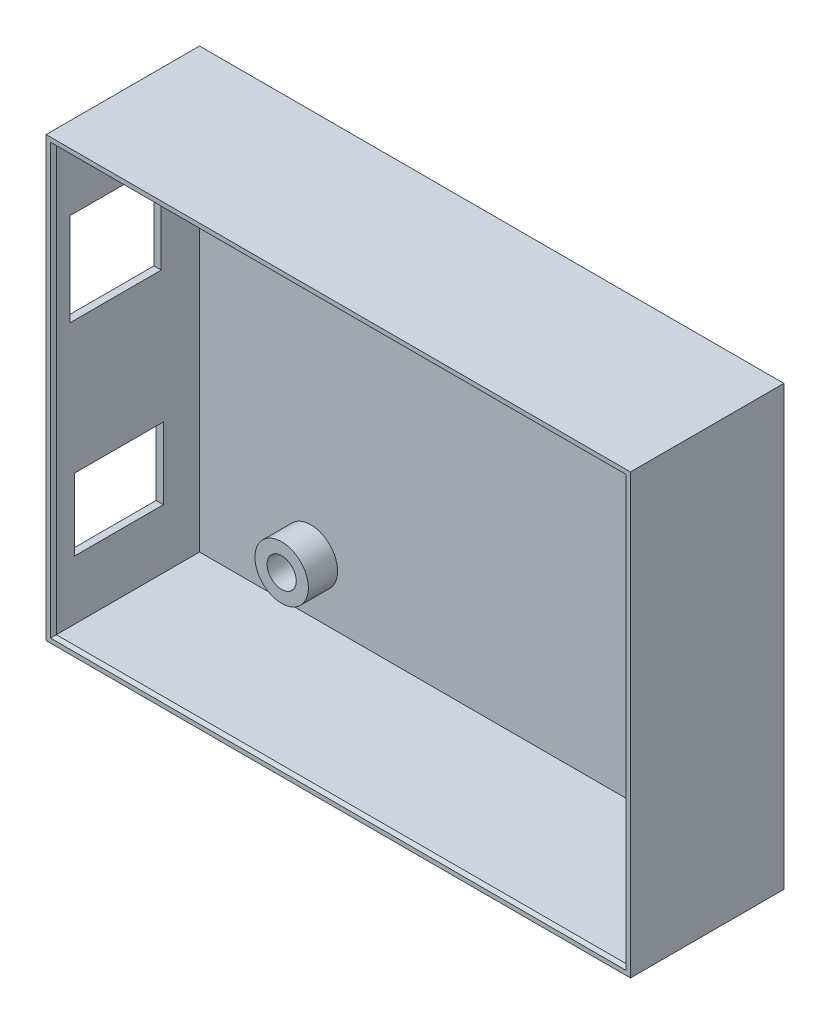
ISO-10303-21;
HEADER;
FILE_DESCRIPTION(('STEP AP214'),'2;1');
FILE_NAME('part.step','',(''),(''),'','','');
FILE_SCHEMA(('AUTOMOTIVE_DESIGN { 1 0 10303 214 1 1 1 1 }'));
ENDSEC;
DATA;
#1=APPLICATION_CONTEXT('core data for automotive mechanical design processes');
#2=APPLICATION_PROTOCOL_DEFINITION('international standard','automotive_design',2000,#1);
#3=PRODUCT_CONTEXT('',#1,'mechanical');
#4=PRODUCT('Part','Part','',(#3));
#5=PRODUCT_RELATED_PRODUCT_CATEGORY('part','',(#4));
#6=PRODUCT_DEFINITION_FORMATION('','',#4);
#7=PRODUCT_DEFINITION_CONTEXT('part definition',#1,'design');
#8=PRODUCT_DEFINITION('design','',#6,#7);
#9=PRODUCT_DEFINITION_SHAPE('','',#8);
#10=(LENGTH_UNIT() NAMED_UNIT(*) SI_UNIT(.MILLI.,.METRE.));
#11=(NAMED_UNIT(*) PLANE_ANGLE_UNIT() SI_UNIT($,.RADIAN.));
#12=(NAMED_UNIT(*) SI_UNIT($,.STERADIAN.) SOLID_ANGLE_UNIT());
#13=UNCERTAINTY_MEASURE_WITH_UNIT(LENGTH_MEASURE(1.E-05),#10,'distance_accuracy_value','');
#14=(GEOMETRIC_REPRESENTATION_CONTEXT(3) GLOBAL_UNCERTAINTY_ASSIGNED_CONTEXT((#13)) GLOBAL_UNIT_ASSIGNED_CONTEXT((#10,
#11,#12)) REPRESENTATION_CONTEXT('',''));
#15=CARTESIAN_POINT('',(0.,0.,0.));
#16=DIRECTION('',(0.,0.,1.));
#17=DIRECTION('',(1.,0.,0.));
#18=AXIS2_PLACEMENT_3D('',#15,#16,#17);
#19=CARTESIAN_POINT('',(57.021978021978,28.6703296703297,22.));
#20=DIRECTION('',(0.,-1.,0.));
#21=DIRECTION('',(0.,0.,-1.));
#22=AXIS2_PLACEMENT_3D('',#19,#20,#21);
#23=PLANE('',#22);
#24=DIRECTION('',(0.,0.,-1.));
#25=VECTOR('',#24,1.);
#26=CARTESIAN_POINT('',(57.021978021978,28.6703296703297,22.));
#27=LINE('',#26,#25);
#28=CARTESIAN_POINT('',(57.021978021978,28.6703296703297,21.6));
#29=VERTEX_POINT('',#28);
#30=CARTESIAN_POINT('',(57.021978021978,28.6703296703297,2.));
#31=VERTEX_POINT('',#30);
#32=EDGE_CURVE('E336',#29,#31,#27,.T.);
#33=ORIENTED_EDGE('',*,*,#32,.F.);
#34=DIRECTION('',(-1.,0.,0.));
#35=VECTOR('',#34,1.);
#36=CARTESIAN_POINT('',(57.021978021978,28.6703296703297,21.6));
#37=LINE('',#36,#35);
#38=CARTESIAN_POINT('',(-20.978021978022,28.6703296703297,21.6));
#39=VERTEX_POINT('',#38);
#40=EDGE_CURVE('E11',#29,#39,#37,.T.);
#41=ORIENTED_EDGE('',*,*,#40,.T.);
#42=DIRECTION('',(0.,0.,-1.));
#43=VECTOR('',#42,1.);
#44=CARTESIAN_POINT('',(-20.978021978022,28.6703296703297,22.));
#45=LINE('',#44,#43);
#46=CARTESIAN_POINT('',(-20.978021978022,28.6703296703297,2.));
#47=VERTEX_POINT('',#46);
#48=EDGE_CURVE('E342',#39,#47,#45,.T.);
#49=ORIENTED_EDGE('',*,*,#48,.T.);
#50=DIRECTION('',(-1.,0.,0.));
#51=VECTOR('',#50,1.);
#52=CARTESIAN_POINT('',(57.021978021978,28.6703296703297,2.));
#53=LINE('',#52,#51);
#54=CARTESIAN_POINT('',(-8.04659818687331,28.6703296703297,2.));
#55=VERTEX_POINT('',#54);
#56=EDGE_CURVE('E327',#55,#47,#53,.T.);
#57=ORIENTED_EDGE('',*,*,#56,.F.);
#58=DIRECTION('',(0.,0.,-1.));
#59=VECTOR('',#58,1.);
#60=CARTESIAN_POINT('',(-8.04659818687331,28.6703296703297,6.));
#61=LINE('',#60,#59);
#62=CARTESIAN_POINT('',(-8.04659818687331,28.6703296703297,6.));
#63=VERTEX_POINT('',#62);
#64=EDGE_CURVE('E200',#55,#63,#61,.F.);
#65=ORIENTED_EDGE('',*,*,#64,.T.);
#66=DIRECTION('',(-1.,0.,0.));
#67=VECTOR('',#66,1.);
#68=CARTESIAN_POINT('',(57.021978021978,28.6703296703297,6.));
#69=LINE('',#68,#67);
#70=CARTESIAN_POINT('',(-3.45151384874039,28.6703296703297,6.));
#71=VERTEX_POINT('',#70);
#72=EDGE_CURVE('E205',#71,#63,#69,.T.);
#73=ORIENTED_EDGE('',*,*,#72,.F.);
#74=DIRECTION('',(0.,0.,-1.));
#75=VECTOR('',#74,1.);
#76=CARTESIAN_POINT('',(-3.45151384874039,28.6703296703297,6.));
#77=LINE('',#76,#75);
#78=CARTESIAN_POINT('',(-3.45151384874039,28.6703296703297,2.));
#79=VERTEX_POINT('',#78);
#80=EDGE_CURVE('E190',#71,#79,#77,.T.);
#81=ORIENTED_EDGE('',*,*,#80,.T.);
#82=EDGE_CURVE('E324',#31,#79,#53,.T.);
#83=ORIENTED_EDGE('',*,*,#82,.F.);
#84=EDGE_LOOP('',(#33,#41,#49,#57,#65,#73,#81,#83));
#85=FACE_BOUND('',#84,.T.);
#86=ADVANCED_FACE('F39',(#85),#23,.T.);
#87=CARTESIAN_POINT('',(-21.978021978022,29.6703296703297,2.));
#88=DIRECTION('',(1.,0.,0.));
#89=DIRECTION('',(0.,0.,-1.));
#90=AXIS2_PLACEMENT_3D('',#87,#88,#89);
#91=PLANE('',#90);
#92=DIRECTION('',(0.,0.,1.));
#93=VECTOR('',#92,1.);
#94=CARTESIAN_POINT('',(-21.978021978022,6.7203296703303,7.24));
#95=LINE('',#94,#93);
#96=CARTESIAN_POINT('',(-21.978021978022,6.7203296703303,7.24));
#97=VERTEX_POINT('',#96);
#98=CARTESIAN_POINT('',(-21.978021978022,6.7203296703303,19.7295944382533));
#99=VERTEX_POINT('',#98);
#100=EDGE_CURVE('E286',#97,#99,#95,.T.);
#101=ORIENTED_EDGE('',*,*,#100,.F.);
#102=DIRECTION('',(0.,-1.,0.));
#103=VECTOR('',#102,1.);
#104=CARTESIAN_POINT('',(-21.978021978022,19.4203296703303,7.24));
#105=LINE('',#104,#103);
#106=CARTESIAN_POINT('',(-21.978021978022,19.4203296703303,7.24));
#107=VERTEX_POINT('',#106);
#108=EDGE_CURVE('E284',#107,#97,#105,.T.);
#109=ORIENTED_EDGE('',*,*,#108,.F.);
#110=DIRECTION('',(0.,0.,-1.));
#111=VECTOR('',#110,1.);
#112=CARTESIAN_POINT('',(-21.978021978022,19.4203296703303,7.24));
#113=LINE('',#112,#111);
#114=CARTESIAN_POINT('',(-21.978021978022,19.4203296703303,19.7295944382533));
#115=VERTEX_POINT('',#114);
#116=EDGE_CURVE('E293',#115,#107,#113,.T.);
#117=ORIENTED_EDGE('',*,*,#116,.F.);
#118=DIRECTION('',(0.,1.,0.));
#119=VECTOR('',#118,1.);
#120=CARTESIAN_POINT('',(-21.978021978022,19.4203296703303,19.7295944382533));
#121=LINE('',#120,#119);
#122=EDGE_CURVE('E290',#99,#115,#121,.T.);
#123=ORIENTED_EDGE('',*,*,#122,.F.);
#124=EDGE_LOOP('',(#101,#109,#117,#123));
#125=FACE_BOUND('',#124,.T.);
#126=DIRECTION('',(0.,0.,1.));
#127=VECTOR('',#126,1.);
#128=CARTESIAN_POINT('',(-21.978021978022,-21.2394045550651,6.94904904372408));
#129=LINE('',#128,#127);
#130=CARTESIAN_POINT('',(-21.978021978022,-21.2394045550651,6.94904904372408));
#131=VERTEX_POINT('',#130);
#132=CARTESIAN_POINT('',(-21.978021978022,-21.2394045550651,19.1175178620637));
#133=VERTEX_POINT('',#132);
#134=EDGE_CURVE('E320',#131,#133,#129,.T.);
#135=ORIENTED_EDGE('',*,*,#134,.F.);
#136=DIRECTION('',(0.,-1.,0.));
#137=VECTOR('',#136,1.);
#138=CARTESIAN_POINT('',(-21.978021978022,-11.4232741193679,6.94904904372408));
#139=LINE('',#138,#137);
#140=CARTESIAN_POINT('',(-21.978021978022,-11.4232741193679,6.94904904372408));
#141=VERTEX_POINT('',#140);
#142=EDGE_CURVE('E287',#141,#131,#139,.T.);
#143=ORIENTED_EDGE('',*,*,#142,.F.);
#144=DIRECTION('',(0.,0.,-1.));
#145=VECTOR('',#144,1.);
#146=CARTESIAN_POINT('',(-21.978021978022,-11.4232741193679,6.94904904372408));
#147=LINE('',#146,#145);
#148=CARTESIAN_POINT('',(-21.978021978022,-11.4232741193679,19.1175178620637));
#149=VERTEX_POINT('',#148);
#150=EDGE_CURVE('E309',#149,#141,#147,.T.);
#151=ORIENTED_EDGE('',*,*,#150,.F.);
#152=DIRECTION('',(0.,1.,0.));
#153=VECTOR('',#152,1.);
#154=CARTESIAN_POINT('',(-21.978021978022,-11.4232741193679,19.1175178620637));
#155=LINE('',#154,#153);
#156=EDGE_CURVE('E317',#133,#149,#155,.T.);
#157=ORIENTED_EDGE('',*,*,#156,.F.);
#158=EDGE_LOOP('',(#135,#143,#151,#157));
#159=FACE_BOUND('',#158,.T.);
#160=DIRECTION('',(0.,0.,-1.));
#161=VECTOR('',#160,1.);
#162=CARTESIAN_POINT('',(-21.978021978022,29.6703296703297,2.));
#163=LINE('',#162,#161);
#164=CARTESIAN_POINT('',(-21.978021978022,29.6703296703297,22.));
#165=VERTEX_POINT('',#164);
#166=CARTESIAN_POINT('',(-21.978021978022,29.6703296703297,1.));
#167=VERTEX_POINT('',#166);
#168=EDGE_CURVE('E356',#165,#167,#163,.T.);
#169=ORIENTED_EDGE('',*,*,#168,.T.);
#170=DIRECTION('',(0.,-1.,0.));
#171=VECTOR('',#170,1.);
#172=CARTESIAN_POINT('',(-21.978021978022,29.6703296703297,1.));
#173=LINE('',#172,#171);
#174=CARTESIAN_POINT('',(-21.978021978022,-30.3296703296703,1.));
#175=VERTEX_POINT('',#174);
#176=EDGE_CURVE('E384',#167,#175,#173,.T.);
#177=ORIENTED_EDGE('',*,*,#176,.T.);
#178=DIRECTION('',(0.,0.,-1.));
#179=VECTOR('',#178,1.);
#180=CARTESIAN_POINT('',(-21.978021978022,-30.3296703296703,2.));
#181=LINE('',#180,#179);
#182=CARTESIAN_POINT('',(-21.978021978022,-30.3296703296703,22.));
#183=VERTEX_POINT('',#182);
#184=EDGE_CURVE('E365',#183,#175,#181,.T.);
#185=ORIENTED_EDGE('',*,*,#184,.F.);
#186=DIRECTION('',(0.,-1.,0.));
#187=VECTOR('',#186,1.);
#188=CARTESIAN_POINT('',(-21.978021978022,29.6703296703297,22.));
#189=LINE('',#188,#187);
#190=EDGE_CURVE('E347',#165,#183,#189,.T.);
#191=ORIENTED_EDGE('',*,*,#190,.F.);
#192=EDGE_LOOP('',(#169,#177,#185,#191));
#193=FACE_BOUND('',#192,.T.);
#194=ADVANCED_FACE('F445',(#125,#159,#193),#91,.F.);
#195=CARTESIAN_POINT('',(-21.978021978022,-30.3296703296703,2.));
#196=DIRECTION('',(0.,1.,0.));
#197=DIRECTION('',(-1.,0.,0.));
#198=AXIS2_PLACEMENT_3D('',#195,#196,#197);
#199=PLANE('',#198);
#200=ORIENTED_EDGE('',*,*,#184,.T.);
#201=DIRECTION('',(1.,0.,0.));
#202=VECTOR('',#201,1.);
#203=CARTESIAN_POINT('',(-21.978021978022,-30.3296703296703,1.));
#204=LINE('',#203,#202);
#205=CARTESIAN_POINT('',(58.021978021978,-30.3296703296703,1.));
#206=VERTEX_POINT('',#205);
#207=EDGE_CURVE('E368',#175,#206,#204,.T.);
#208=ORIENTED_EDGE('',*,*,#207,.T.);
#209=DIRECTION('',(0.,0.,-1.));
#210=VECTOR('',#209,1.);
#211=CARTESIAN_POINT('',(58.021978021978,-30.3296703296703,2.));
#212=LINE('',#211,#210);
#213=CARTESIAN_POINT('',(58.021978021978,-30.3296703296703,22.));
#214=VERTEX_POINT('',#213);
#215=EDGE_CURVE('E362',#214,#206,#212,.T.);
#216=ORIENTED_EDGE('',*,*,#215,.F.);
#217=DIRECTION('',(1.,0.,0.));
#218=VECTOR('',#217,1.);
#219=CARTESIAN_POINT('',(-21.978021978022,-30.3296703296703,22.));
#220=LINE('',#219,#218);
#221=EDGE_CURVE('E350',#183,#214,#220,.T.);
#222=ORIENTED_EDGE('',*,*,#221,.F.);
#223=EDGE_LOOP('',(#200,#208,#216,#222));
#224=FACE_BOUND('',#223,.T.);
#225=ADVANCED_FACE('F452',(#224),#199,.F.);
#226=CARTESIAN_POINT('',(58.021978021978,29.6703296703297,2.));
#227=DIRECTION('',(-1.,0.,0.));
#228=DIRECTION('',(0.,0.,1.));
#229=AXIS2_PLACEMENT_3D('',#226,#227,#228);
#230=PLANE('',#229);
#231=ORIENTED_EDGE('',*,*,#215,.T.);
#232=DIRECTION('',(0.,1.,0.));
#233=VECTOR('',#232,1.);
#234=CARTESIAN_POINT('',(58.021978021978,29.6703296703297,1.));
#235=LINE('',#234,#233);
#236=CARTESIAN_POINT('',(58.021978021978,29.6703296703297,1.));
#237=VERTEX_POINT('',#236);
#238=EDGE_CURVE('E380',#206,#237,#235,.T.);
#239=ORIENTED_EDGE('',*,*,#238,.T.);
#240=DIRECTION('',(0.,0.,-1.));
#241=VECTOR('',#240,1.);
#242=CARTESIAN_POINT('',(58.021978021978,29.6703296703297,2.));
#243=LINE('',#242,#241);
#244=CARTESIAN_POINT('',(58.021978021978,29.6703296703297,22.));
#245=VERTEX_POINT('',#244);
#246=EDGE_CURVE('E359',#245,#237,#243,.T.);
#247=ORIENTED_EDGE('',*,*,#246,.F.);
#248=DIRECTION('',(0.,1.,0.));
#249=VECTOR('',#248,1.);
#250=CARTESIAN_POINT('',(58.021978021978,-30.3296703296703,22.));
#251=LINE('',#250,#249);
#252=EDGE_CURVE('E353',#214,#245,#251,.T.);
#253=ORIENTED_EDGE('',*,*,#252,.F.);
#254=EDGE_LOOP('',(#231,#239,#247,#253));
#255=FACE_BOUND('',#254,.T.);
#256=ADVANCED_FACE('F496',(#255),#230,.F.);
#257=CARTESIAN_POINT('',(-21.978021978022,29.6703296703297,2.));
#258=DIRECTION('',(0.,-1.,0.));
#259=DIRECTION('',(0.,0.,-1.));
#260=AXIS2_PLACEMENT_3D('',#257,#258,#259);
#261=PLANE('',#260);
#262=ORIENTED_EDGE('',*,*,#246,.T.);
#263=DIRECTION('',(-1.,0.,0.));
#264=VECTOR('',#263,1.);
#265=CARTESIAN_POINT('',(-21.978021978022,29.6703296703297,1.));
#266=LINE('',#265,#264);
#267=EDGE_CURVE('E382',#237,#167,#266,.T.);
#268=ORIENTED_EDGE('',*,*,#267,.T.);
#269=ORIENTED_EDGE('',*,*,#168,.F.);
#270=DIRECTION('',(-1.,0.,0.));
#271=VECTOR('',#270,1.);
#272=CARTESIAN_POINT('',(58.021978021978,29.6703296703297,22.));
#273=LINE('',#272,#271);
#274=EDGE_CURVE('E344',#245,#165,#273,.T.);
#275=ORIENTED_EDGE('',*,*,#274,.F.);
#276=EDGE_LOOP('',(#262,#268,#269,#275));
#277=FACE_BOUND('',#276,.T.);
#278=ADVANCED_FACE('F467',(#277),#261,.F.);
#279=CARTESIAN_POINT('',(0.,0.,0.));
#280=DIRECTION('',(0.,0.,1.));
#281=DIRECTION('',(1.,0.,0.));
#282=AXIS2_PLACEMENT_3D('',#279,#280,#281);
#283=PLANE('',#282);
#284=DIRECTION('',(0.,-1.,0.));
#285=VECTOR('',#284,1.);
#286=CARTESIAN_POINT('',(57.021978021978,0.,0.));
#287=LINE('',#286,#285);
#288=CARTESIAN_POINT('',(57.021978021978,28.6703296703297,0.));
#289=VERTEX_POINT('',#288);
#290=CARTESIAN_POINT('',(57.021978021978,-29.3296703296703,0.));
#291=VERTEX_POINT('',#290);
#292=EDGE_CURVE('E375',#289,#291,#287,.T.);
#293=ORIENTED_EDGE('',*,*,#292,.T.);
#294=DIRECTION('',(-1.,0.,0.));
#295=VECTOR('',#294,1.);
#296=CARTESIAN_POINT('',(0.,-29.3296703296703,0.));
#297=LINE('',#296,#295);
#298=CARTESIAN_POINT('',(-20.978021978022,-29.3296703296703,0.));
#299=VERTEX_POINT('',#298);
#300=EDGE_CURVE('E377',#291,#299,#297,.T.);
#301=ORIENTED_EDGE('',*,*,#300,.T.);
#302=DIRECTION('',(0.,1.,0.));
#303=VECTOR('',#302,1.);
#304=CARTESIAN_POINT('',(-20.978021978022,0.,0.));
#305=LINE('',#304,#303);
#306=CARTESIAN_POINT('',(-20.978021978022,28.6703296703297,0.));
#307=VERTEX_POINT('',#306);
#308=EDGE_CURVE('E371',#299,#307,#305,.T.);
#309=ORIENTED_EDGE('',*,*,#308,.T.);
#310=DIRECTION('',(1.,0.,0.));
#311=VECTOR('',#310,1.);
#312=CARTESIAN_POINT('',(0.,28.6703296703297,0.));
#313=LINE('',#312,#311);
#314=EDGE_CURVE('E373',#307,#289,#313,.T.);
#315=ORIENTED_EDGE('',*,*,#314,.T.);
#316=EDGE_LOOP('',(#293,#301,#309,#315));
#317=FACE_BOUND('',#316,.T.);
#318=ADVANCED_FACE('F459',(#317),#283,.F.);
#319=CARTESIAN_POINT('',(0.,0.,22.));
#320=DIRECTION('',(0.,0.,1.));
#321=DIRECTION('',(1.,0.,0.));
#322=AXIS2_PLACEMENT_3D('',#319,#320,#321);
#323=PLANE('',#322);
#324=DIRECTION('',(0.,-1.,0.));
#325=VECTOR('',#324,1.);
#326=CARTESIAN_POINT('',(57.421978021978,0.,22.));
#327=LINE('',#326,#325);
#328=CARTESIAN_POINT('',(57.421978021978,29.0703296703297,22.));
#329=VERTEX_POINT('',#328);
#330=CARTESIAN_POINT('',(57.421978021978,-29.7296703296703,22.));
#331=VERTEX_POINT('',#330);
#332=EDGE_CURVE('E230',#329,#331,#327,.T.);
#333=ORIENTED_EDGE('',*,*,#332,.T.);
#334=DIRECTION('',(-1.,0.,0.));
#335=VECTOR('',#334,1.);
#336=CARTESIAN_POINT('',(0.,-29.7296703296703,22.));
#337=LINE('',#336,#335);
#338=CARTESIAN_POINT('',(-21.378021978022,-29.7296703296703,22.));
#339=VERTEX_POINT('',#338);
#340=EDGE_CURVE('E232',#331,#339,#337,.T.);
#341=ORIENTED_EDGE('',*,*,#340,.T.);
#342=DIRECTION('',(0.,1.,0.));
#343=VECTOR('',#342,1.);
#344=CARTESIAN_POINT('',(-21.378021978022,0.,22.));
#345=LINE('',#344,#343);
#346=CARTESIAN_POINT('',(-21.378021978022,29.0703296703297,22.));
#347=VERTEX_POINT('',#346);
#348=EDGE_CURVE('E228',#339,#347,#345,.T.);
#349=ORIENTED_EDGE('',*,*,#348,.T.);
#350=DIRECTION('',(1.,0.,0.));
#351=VECTOR('',#350,1.);
#352=CARTESIAN_POINT('',(0.,29.0703296703297,22.));
#353=LINE('',#352,#351);
#354=EDGE_CURVE('E226',#347,#329,#353,.T.);
#355=ORIENTED_EDGE('',*,*,#354,.T.);
#356=EDGE_LOOP('',(#333,#341,#349,#355));
#357=FACE_BOUND('',#356,.T.);
#358=ORIENTED_EDGE('',*,*,#274,.T.);
#359=ORIENTED_EDGE('',*,*,#190,.T.);
#360=ORIENTED_EDGE('',*,*,#221,.T.);
#361=ORIENTED_EDGE('',*,*,#252,.T.);
#362=EDGE_LOOP('',(#358,#359,#360,#361));
#363=FACE_BOUND('',#362,.T.);
#364=ADVANCED_FACE('F458',(#357,#363),#323,.T.);
#365=CARTESIAN_POINT('',(-20.978021978022,28.6703296703297,22.));
#366=DIRECTION('',(1.,0.,0.));
#367=DIRECTION('',(0.,0.,-1.));
#368=AXIS2_PLACEMENT_3D('',#365,#366,#367);
#369=PLANE('',#368);
#370=DIRECTION('',(0.,1.,0.));
#371=VECTOR('',#370,1.);
#372=CARTESIAN_POINT('',(-20.978021978022,28.6703296703297,7.23999999999999));
#373=LINE('',#372,#371);
#374=CARTESIAN_POINT('',(-20.978021978022,6.7203296703303,7.24));
#375=VERTEX_POINT('',#374);
#376=CARTESIAN_POINT('',(-20.978021978022,19.4203296703303,7.24));
#377=VERTEX_POINT('',#376);
#378=EDGE_CURVE('E411',#375,#377,#373,.T.);
#379=ORIENTED_EDGE('',*,*,#378,.F.);
#380=DIRECTION('',(0.,0.,-1.));
#381=VECTOR('',#380,1.);
#382=CARTESIAN_POINT('',(-20.978021978022,6.7203296703303,22.));
#383=LINE('',#382,#381);
#384=CARTESIAN_POINT('',(-20.978021978022,6.7203296703303,19.7295944382533));
#385=VERTEX_POINT('',#384);
#386=EDGE_CURVE('E404',#385,#375,#383,.T.);
#387=ORIENTED_EDGE('',*,*,#386,.F.);
#388=DIRECTION('',(0.,-1.,0.));
#389=VECTOR('',#388,1.);
#390=CARTESIAN_POINT('',(-20.978021978022,28.6703296703297,19.7295944382533));
#391=LINE('',#390,#389);
#392=CARTESIAN_POINT('',(-20.978021978022,19.4203296703303,19.7295944382533));
#393=VERTEX_POINT('',#392);
#394=EDGE_CURVE('E406',#393,#385,#391,.T.);
#395=ORIENTED_EDGE('',*,*,#394,.F.);
#396=DIRECTION('',(0.,0.,1.));
#397=VECTOR('',#396,1.);
#398=CARTESIAN_POINT('',(-20.978021978022,19.4203296703303,22.));
#399=LINE('',#398,#397);
#400=EDGE_CURVE('E409',#377,#393,#399,.T.);
#401=ORIENTED_EDGE('',*,*,#400,.F.);
#402=EDGE_LOOP('',(#379,#387,#395,#401));
#403=FACE_BOUND('',#402,.T.);
#404=DIRECTION('',(0.,1.,0.));
#405=VECTOR('',#404,1.);
#406=CARTESIAN_POINT('',(-20.978021978022,28.6703296703297,6.94904904372407));
#407=LINE('',#406,#405);
#408=CARTESIAN_POINT('',(-20.978021978022,-21.2394045550651,6.94904904372408));
#409=VERTEX_POINT('',#408);
#410=CARTESIAN_POINT('',(-20.978021978022,-11.4232741193679,6.94904904372408));
#411=VERTEX_POINT('',#410);
#412=EDGE_CURVE('E402',#409,#411,#407,.T.);
#413=ORIENTED_EDGE('',*,*,#412,.F.);
#414=DIRECTION('',(0.,0.,-1.));
#415=VECTOR('',#414,1.);
#416=CARTESIAN_POINT('',(-20.978021978022,-21.2394045550651,22.));
#417=LINE('',#416,#415);
#418=CARTESIAN_POINT('',(-20.978021978022,-21.2394045550651,19.1175178620637));
#419=VERTEX_POINT('',#418);
#420=EDGE_CURVE('E386',#419,#409,#417,.T.);
#421=ORIENTED_EDGE('',*,*,#420,.F.);
#422=DIRECTION('',(0.,-1.,0.));
#423=VECTOR('',#422,1.);
#424=CARTESIAN_POINT('',(-20.978021978022,28.6703296703297,19.1175178620637));
#425=LINE('',#424,#423);
#426=CARTESIAN_POINT('',(-20.978021978022,-11.4232741193679,19.1175178620637));
#427=VERTEX_POINT('',#426);
#428=EDGE_CURVE('E397',#427,#419,#425,.T.);
#429=ORIENTED_EDGE('',*,*,#428,.F.);
#430=DIRECTION('',(0.,0.,1.));
#431=VECTOR('',#430,1.);
#432=CARTESIAN_POINT('',(-20.978021978022,-11.4232741193679,22.));
#433=LINE('',#432,#431);
#434=EDGE_CURVE('E400',#411,#427,#433,.T.);
#435=ORIENTED_EDGE('',*,*,#434,.F.);
#436=EDGE_LOOP('',(#413,#421,#429,#435));
#437=FACE_BOUND('',#436,.T.);
#438=ORIENTED_EDGE('',*,*,#48,.F.);
#439=DIRECTION('',(0.,-1.,0.));
#440=VECTOR('',#439,1.);
#441=CARTESIAN_POINT('',(-20.978021978022,28.6703296703297,21.6));
#442=LINE('',#441,#440);
#443=CARTESIAN_POINT('',(-20.978021978022,-29.3296703296703,21.6));
#444=VERTEX_POINT('',#443);
#445=EDGE_CURVE('E49',#39,#444,#442,.T.);
#446=ORIENTED_EDGE('',*,*,#445,.T.);
#447=DIRECTION('',(0.,0.,-1.));
#448=VECTOR('',#447,1.);
#449=CARTESIAN_POINT('',(-20.978021978022,-29.3296703296703,22.));
#450=LINE('',#449,#448);
#451=CARTESIAN_POINT('',(-20.978021978022,-29.3296703296703,2.));
#452=VERTEX_POINT('',#451);
#453=EDGE_CURVE('E340',#444,#452,#450,.T.);
#454=ORIENTED_EDGE('',*,*,#453,.T.);
#455=DIRECTION('',(0.,-1.,0.));
#456=VECTOR('',#455,1.);
#457=CARTESIAN_POINT('',(-20.978021978022,28.6703296703297,2.));
#458=LINE('',#457,#456);
#459=EDGE_CURVE('E326',#47,#452,#458,.T.);
#460=ORIENTED_EDGE('',*,*,#459,.F.);
#461=EDGE_LOOP('',(#438,#446,#454,#460));
#462=FACE_BOUND('',#461,.T.);
#463=ADVANCED_FACE('F456',(#403,#437,#462),#369,.T.);
#464=CARTESIAN_POINT('',(-20.978021978022,-29.3296703296703,22.));
#465=DIRECTION('',(0.,1.,0.));
#466=DIRECTION('',(0.,0.,1.));
#467=AXIS2_PLACEMENT_3D('',#464,#465,#466);
#468=PLANE('',#467);
#469=ORIENTED_EDGE('',*,*,#453,.F.);
#470=DIRECTION('',(1.,0.,0.));
#471=VECTOR('',#470,1.);
#472=CARTESIAN_POINT('',(-20.978021978022,-29.3296703296703,21.6));
#473=LINE('',#472,#471);
#474=CARTESIAN_POINT('',(57.021978021978,-29.3296703296703,21.6));
#475=VERTEX_POINT('',#474);
#476=EDGE_CURVE('E223',#444,#475,#473,.T.);
#477=ORIENTED_EDGE('',*,*,#476,.T.);
#478=DIRECTION('',(0.,0.,-1.));
#479=VECTOR('',#478,1.);
#480=CARTESIAN_POINT('',(57.021978021978,-29.3296703296703,22.));
#481=LINE('',#480,#479);
#482=CARTESIAN_POINT('',(57.021978021978,-29.3296703296703,2.));
#483=VERTEX_POINT('',#482);
#484=EDGE_CURVE('E338',#475,#483,#481,.T.);
#485=ORIENTED_EDGE('',*,*,#484,.T.);
#486=DIRECTION('',(1.,0.,0.));
#487=VECTOR('',#486,1.);
#488=CARTESIAN_POINT('',(-20.978021978022,-29.3296703296703,2.));
#489=LINE('',#488,#487);
#490=EDGE_CURVE('E330',#452,#483,#489,.T.);
#491=ORIENTED_EDGE('',*,*,#490,.F.);
#492=EDGE_LOOP('',(#469,#477,#485,#491));
#493=FACE_BOUND('',#492,.T.);
#494=ADVANCED_FACE('F464',(#493),#468,.T.);
#495=CARTESIAN_POINT('',(57.021978021978,-29.3296703296703,22.));
#496=DIRECTION('',(-1.,0.,0.));
#497=DIRECTION('',(0.,0.,1.));
#498=AXIS2_PLACEMENT_3D('',#495,#496,#497);
#499=PLANE('',#498);
#500=ORIENTED_EDGE('',*,*,#484,.F.);
#501=DIRECTION('',(0.,1.,0.));
#502=VECTOR('',#501,1.);
#503=CARTESIAN_POINT('',(57.021978021978,-29.3296703296703,21.6));
#504=LINE('',#503,#502);
#505=EDGE_CURVE('E63',#475,#29,#504,.T.);
#506=ORIENTED_EDGE('',*,*,#505,.T.);
#507=ORIENTED_EDGE('',*,*,#32,.T.);
#508=DIRECTION('',(0.,1.,0.));
#509=VECTOR('',#508,1.);
#510=CARTESIAN_POINT('',(57.021978021978,-29.3296703296703,2.));
#511=LINE('',#510,#509);
#512=EDGE_CURVE('E333',#483,#31,#511,.T.);
#513=ORIENTED_EDGE('',*,*,#512,.F.);
#514=EDGE_LOOP('',(#500,#506,#507,#513));
#515=FACE_BOUND('',#514,.T.);
#516=ADVANCED_FACE('F436',(#515),#499,.T.);
#517=CARTESIAN_POINT('',(0.,0.,2.));
#518=DIRECTION('',(0.,0.,1.));
#519=DIRECTION('',(1.,0.,0.));
#520=AXIS2_PLACEMENT_3D('',#517,#518,#519);
#521=PLANE('',#520);
#522=CARTESIAN_POINT('',(-5.73284137795256,-22.1381758628045,2.));
#523=DIRECTION('',(0.,0.,1.));
#524=DIRECTION('',(1.,0.,0.));
#525=AXIS2_PLACEMENT_3D('',#522,#523,#524);
#526=CIRCLE('',#525,3.66058840105191);
#527=CARTESIAN_POINT('',(-2.07225297690065,-22.1381758628045,2.));
#528=VERTEX_POINT('',#527);
#529=EDGE_CURVE('E252',#528,#528,#526,.T.);
#530=ORIENTED_EDGE('',*,*,#529,.F.);
#531=EDGE_LOOP('',(#530));
#532=FACE_BOUND('',#531,.T.);
#533=CARTESIAN_POINT('',(45.2853829157704,-17.0585885765074,2.));
#534=DIRECTION('',(0.,0.,1.));
#535=DIRECTION('',(1.,0.,0.));
#536=AXIS2_PLACEMENT_3D('',#533,#534,#535);
#537=CIRCLE('',#536,3.86766524090038);
#538=CARTESIAN_POINT('',(49.1530481566708,-17.0585885765074,2.));
#539=VERTEX_POINT('',#538);
#540=EDGE_CURVE('E263',#539,#539,#537,.T.);
#541=ORIENTED_EDGE('',*,*,#540,.F.);
#542=EDGE_LOOP('',(#541));
#543=FACE_BOUND('',#542,.T.);
#544=CARTESIAN_POINT('',(45.2709205469533,10.8627361596141,2.));
#545=DIRECTION('',(0.,0.,1.));
#546=DIRECTION('',(1.,0.,0.));
#547=AXIS2_PLACEMENT_3D('',#544,#545,#546);
#548=CIRCLE('',#547,3.31245309918478);
#549=CARTESIAN_POINT('',(48.5833736461381,10.8627361596141,2.));
#550=VERTEX_POINT('',#549);
#551=EDGE_CURVE('E272',#550,#550,#548,.T.);
#552=ORIENTED_EDGE('',*,*,#551,.F.);
#553=EDGE_LOOP('',(#552));
#554=FACE_BOUND('',#553,.T.);
#555=ORIENTED_EDGE('',*,*,#82,.T.);
#556=CARTESIAN_POINT('',(-5.74905601780685,26.1216668876383,2.));
#557=DIRECTION('',(0.,0.,1.));
#558=DIRECTION('',(1.,0.,0.));
#559=AXIS2_PLACEMENT_3D('',#556,#557,#558);
#560=CIRCLE('',#559,3.4313819371377);
#561=EDGE_CURVE('E196',#79,#55,#560,.F.);
#562=ORIENTED_EDGE('',*,*,#561,.T.);
#563=ORIENTED_EDGE('',*,*,#56,.T.);
#564=ORIENTED_EDGE('',*,*,#459,.T.);
#565=ORIENTED_EDGE('',*,*,#490,.T.);
#566=ORIENTED_EDGE('',*,*,#512,.T.);
#567=EDGE_LOOP('',(#555,#562,#563,#564,#565,#566));
#568=FACE_BOUND('',#567,.T.);
#569=ADVANCED_FACE('F421',(#532,#543,#554,#568),#521,.T.);
#570=CARTESIAN_POINT('',(-21.978021978022,29.6703296703297,1.));
#571=DIRECTION('',(0.,-0.707106781186547,0.707106781186547));
#572=DIRECTION('',(-1.,0.,0.));
#573=AXIS2_PLACEMENT_3D('',#570,#571,#572);
#574=PLANE('',#573);
#575=DIRECTION('',(-0.577350269189626,-0.577350269189626,-0.577350269189626));
#576=VECTOR('',#575,1.);
#577=CARTESIAN_POINT('',(31.3553113553113,3.00366300366299,-25.6666666666667));
#578=LINE('',#577,#576);
#579=EDGE_CURVE('E390',#289,#237,#578,.F.);
#580=ORIENTED_EDGE('',*,*,#579,.F.);
#581=ORIENTED_EDGE('',*,*,#314,.F.);
#582=DIRECTION('',(0.577350269189626,-0.577350269189626,-0.577350269189626));
#583=VECTOR('',#582,1.);
#584=CARTESIAN_POINT('',(-21.978021978022,29.6703296703297,1.));
#585=LINE('',#584,#583);
#586=EDGE_CURVE('E393',#167,#307,#585,.T.);
#587=ORIENTED_EDGE('',*,*,#586,.F.);
#588=ORIENTED_EDGE('',*,*,#267,.F.);
#589=EDGE_LOOP('',(#580,#581,#587,#588));
#590=FACE_BOUND('',#589,.T.);
#591=ADVANCED_FACE('F435',(#590),#574,.F.);
#592=CARTESIAN_POINT('',(-21.978021978022,29.6703296703297,1.));
#593=DIRECTION('',(0.707106781186547,0.,0.707106781186547));
#594=DIRECTION('',(0.,-1.,0.));
#595=AXIS2_PLACEMENT_3D('',#592,#593,#594);
#596=PLANE('',#595);
#597=ORIENTED_EDGE('',*,*,#586,.T.);
#598=ORIENTED_EDGE('',*,*,#308,.F.);
#599=DIRECTION('',(-0.577350269189625,-0.577350269189627,0.577350269189625));
#600=VECTOR('',#599,1.);
#601=CARTESIAN_POINT('',(-1.97802197802197,-10.3296703296703,-19.));
#602=LINE('',#601,#600);
#603=EDGE_CURVE('E388',#175,#299,#602,.F.);
#604=ORIENTED_EDGE('',*,*,#603,.F.);
#605=ORIENTED_EDGE('',*,*,#176,.F.);
#606=EDGE_LOOP('',(#597,#598,#604,#605));
#607=FACE_BOUND('',#606,.T.);
#608=ADVANCED_FACE('F485',(#607),#596,.F.);
#609=CARTESIAN_POINT('',(58.021978021978,29.6703296703297,1.));
#610=DIRECTION('',(-0.707106781186547,0.,0.707106781186547));
#611=DIRECTION('',(0.,1.,0.));
#612=AXIS2_PLACEMENT_3D('',#609,#610,#611);
#613=PLANE('',#612);
#614=ORIENTED_EDGE('',*,*,#579,.T.);
#615=ORIENTED_EDGE('',*,*,#238,.F.);
#616=DIRECTION('',(-0.577350269189625,0.577350269189627,-0.577350269189625));
#617=VECTOR('',#616,1.);
#618=CARTESIAN_POINT('',(38.021978021978,-10.3296703296703,-19.));
#619=LINE('',#618,#617);
#620=EDGE_CURVE('E299',#291,#206,#619,.F.);
#621=ORIENTED_EDGE('',*,*,#620,.F.);
#622=ORIENTED_EDGE('',*,*,#292,.F.);
#623=EDGE_LOOP('',(#614,#615,#621,#622));
#624=FACE_BOUND('',#623,.T.);
#625=ADVANCED_FACE('F493',(#624),#613,.F.);
#626=CARTESIAN_POINT('',(-21.978021978022,-30.3296703296703,1.));
#627=DIRECTION('',(0.,0.707106781186547,0.707106781186549));
#628=DIRECTION('',(1.,0.,0.));
#629=AXIS2_PLACEMENT_3D('',#626,#627,#628);
#630=PLANE('',#629);
#631=ORIENTED_EDGE('',*,*,#603,.T.);
#632=ORIENTED_EDGE('',*,*,#300,.F.);
#633=ORIENTED_EDGE('',*,*,#620,.T.);
#634=ORIENTED_EDGE('',*,*,#207,.F.);
#635=EDGE_LOOP('',(#631,#632,#633,#634));
#636=FACE_BOUND('',#635,.T.);
#637=ADVANCED_FACE('F488',(#636),#630,.F.);
#638=CARTESIAN_POINT('',(-11.978021978022,-11.4232741193679,6.94904904372408));
#639=DIRECTION('',(0.,0.,-1.));
#640=DIRECTION('',(0.,1.,0.));
#641=AXIS2_PLACEMENT_3D('',#638,#639,#640);
#642=PLANE('',#641);
#643=ORIENTED_EDGE('',*,*,#412,.T.);
#644=DIRECTION('',(-1.,0.,0.));
#645=VECTOR('',#644,1.);
#646=CARTESIAN_POINT('',(-11.978021978022,-11.4232741193679,6.94904904372408));
#647=LINE('',#646,#645);
#648=EDGE_CURVE('E283',#411,#141,#647,.T.);
#649=ORIENTED_EDGE('',*,*,#648,.T.);
#650=ORIENTED_EDGE('',*,*,#142,.T.);
#651=DIRECTION('',(-1.,0.,0.));
#652=VECTOR('',#651,1.);
#653=CARTESIAN_POINT('',(-11.978021978022,-21.2394045550651,6.94904904372408));
#654=LINE('',#653,#652);
#655=EDGE_CURVE('E306',#409,#131,#654,.T.);
#656=ORIENTED_EDGE('',*,*,#655,.F.);
#657=EDGE_LOOP('',(#643,#649,#650,#656));
#658=FACE_BOUND('',#657,.T.);
#659=ADVANCED_FACE('F512',(#658),#642,.F.);
#660=CARTESIAN_POINT('',(-11.978021978022,-11.4232741193679,6.94904904372408));
#661=DIRECTION('',(0.,1.,0.));
#662=DIRECTION('',(0.,0.,1.));
#663=AXIS2_PLACEMENT_3D('',#660,#661,#662);
#664=PLANE('',#663);
#665=ORIENTED_EDGE('',*,*,#434,.T.);
#666=DIRECTION('',(-1.,0.,0.));
#667=VECTOR('',#666,1.);
#668=CARTESIAN_POINT('',(-11.978021978022,-11.4232741193679,19.1175178620637));
#669=LINE('',#668,#667);
#670=EDGE_CURVE('E312',#427,#149,#669,.T.);
#671=ORIENTED_EDGE('',*,*,#670,.T.);
#672=ORIENTED_EDGE('',*,*,#150,.T.);
#673=ORIENTED_EDGE('',*,*,#648,.F.);
#674=EDGE_LOOP('',(#665,#671,#672,#673));
#675=FACE_BOUND('',#674,.T.);
#676=ADVANCED_FACE('F572',(#675),#664,.F.);
#677=CARTESIAN_POINT('',(-11.978021978022,-11.4232741193679,19.1175178620637));
#678=DIRECTION('',(0.,0.,1.));
#679=DIRECTION('',(1.,0.,0.));
#680=AXIS2_PLACEMENT_3D('',#677,#678,#679);
#681=PLANE('',#680);
#682=ORIENTED_EDGE('',*,*,#428,.T.);
#683=DIRECTION('',(-1.,0.,0.));
#684=VECTOR('',#683,1.);
#685=CARTESIAN_POINT('',(-11.978021978022,-21.2394045550651,19.1175178620637));
#686=LINE('',#685,#684);
#687=EDGE_CURVE('E310',#419,#133,#686,.T.);
#688=ORIENTED_EDGE('',*,*,#687,.T.);
#689=ORIENTED_EDGE('',*,*,#156,.T.);
#690=ORIENTED_EDGE('',*,*,#670,.F.);
#691=EDGE_LOOP('',(#682,#688,#689,#690));
#692=FACE_BOUND('',#691,.T.);
#693=ADVANCED_FACE('F575',(#692),#681,.F.);
#694=CARTESIAN_POINT('',(-11.978021978022,-21.2394045550651,6.94904904372408));
#695=DIRECTION('',(0.,-1.,0.));
#696=DIRECTION('',(0.,0.,-1.));
#697=AXIS2_PLACEMENT_3D('',#694,#695,#696);
#698=PLANE('',#697);
#699=ORIENTED_EDGE('',*,*,#420,.T.);
#700=ORIENTED_EDGE('',*,*,#655,.T.);
#701=ORIENTED_EDGE('',*,*,#134,.T.);
#702=ORIENTED_EDGE('',*,*,#687,.F.);
#703=EDGE_LOOP('',(#699,#700,#701,#702));
#704=FACE_BOUND('',#703,.T.);
#705=ADVANCED_FACE('F579',(#704),#698,.F.);
#706=CARTESIAN_POINT('',(-11.978021978022,19.4203296703303,7.24));
#707=DIRECTION('',(0.,0.,-1.));
#708=DIRECTION('',(0.,1.,0.));
#709=AXIS2_PLACEMENT_3D('',#706,#707,#708);
#710=PLANE('',#709);
#711=ORIENTED_EDGE('',*,*,#378,.T.);
#712=DIRECTION('',(-1.,0.,0.));
#713=VECTOR('',#712,1.);
#714=CARTESIAN_POINT('',(-11.978021978022,19.4203296703303,7.24));
#715=LINE('',#714,#713);
#716=EDGE_CURVE('E297',#377,#107,#715,.T.);
#717=ORIENTED_EDGE('',*,*,#716,.T.);
#718=ORIENTED_EDGE('',*,*,#108,.T.);
#719=DIRECTION('',(-1.,0.,0.));
#720=VECTOR('',#719,1.);
#721=CARTESIAN_POINT('',(-11.978021978022,6.7203296703303,7.24));
#722=LINE('',#721,#720);
#723=EDGE_CURVE('E296',#375,#97,#722,.T.);
#724=ORIENTED_EDGE('',*,*,#723,.F.);
#725=EDGE_LOOP('',(#711,#717,#718,#724));
#726=FACE_BOUND('',#725,.T.);
#727=ADVANCED_FACE('F583',(#726),#710,.F.);
#728=CARTESIAN_POINT('',(-11.978021978022,19.4203296703303,7.24));
#729=DIRECTION('',(0.,1.,0.));
#730=DIRECTION('',(0.,0.,1.));
#731=AXIS2_PLACEMENT_3D('',#728,#729,#730);
#732=PLANE('',#731);
#733=ORIENTED_EDGE('',*,*,#400,.T.);
#734=DIRECTION('',(-1.,0.,0.));
#735=VECTOR('',#734,1.);
#736=CARTESIAN_POINT('',(-11.978021978022,19.4203296703303,19.7295944382533));
#737=LINE('',#736,#735);
#738=EDGE_CURVE('E300',#393,#115,#737,.T.);
#739=ORIENTED_EDGE('',*,*,#738,.T.);
#740=ORIENTED_EDGE('',*,*,#116,.T.);
#741=ORIENTED_EDGE('',*,*,#716,.F.);
#742=EDGE_LOOP('',(#733,#739,#740,#741));
#743=FACE_BOUND('',#742,.T.);
#744=ADVANCED_FACE('F590',(#743),#732,.F.);
#745=CARTESIAN_POINT('',(-11.978021978022,19.4203296703303,19.7295944382533));
#746=DIRECTION('',(0.,0.,1.));
#747=DIRECTION('',(0.,-1.,0.));
#748=AXIS2_PLACEMENT_3D('',#745,#746,#747);
#749=PLANE('',#748);
#750=ORIENTED_EDGE('',*,*,#394,.T.);
#751=DIRECTION('',(-1.,0.,0.));
#752=VECTOR('',#751,1.);
#753=CARTESIAN_POINT('',(-11.978021978022,6.7203296703303,19.7295944382533));
#754=LINE('',#753,#752);
#755=EDGE_CURVE('E302',#385,#99,#754,.T.);
#756=ORIENTED_EDGE('',*,*,#755,.T.);
#757=ORIENTED_EDGE('',*,*,#122,.T.);
#758=ORIENTED_EDGE('',*,*,#738,.F.);
#759=EDGE_LOOP('',(#750,#756,#757,#758));
#760=FACE_BOUND('',#759,.T.);
#761=ADVANCED_FACE('F595',(#760),#749,.F.);
#762=CARTESIAN_POINT('',(-11.978021978022,6.7203296703303,7.24));
#763=DIRECTION('',(0.,-1.,0.));
#764=DIRECTION('',(0.,0.,-1.));
#765=AXIS2_PLACEMENT_3D('',#762,#763,#764);
#766=PLANE('',#765);
#767=ORIENTED_EDGE('',*,*,#386,.T.);
#768=ORIENTED_EDGE('',*,*,#723,.T.);
#769=ORIENTED_EDGE('',*,*,#100,.T.);
#770=ORIENTED_EDGE('',*,*,#755,.F.);
#771=EDGE_LOOP('',(#767,#768,#769,#770));
#772=FACE_BOUND('',#771,.T.);
#773=ADVANCED_FACE('F592',(#772),#766,.F.);
#774=CARTESIAN_POINT('',(-5.74905601780685,26.1216668876383,6.));
#775=DIRECTION('',(0.,0.,1.));
#776=DIRECTION('',(1.,0.,0.));
#777=AXIS2_PLACEMENT_3D('',#774,#775,#776);
#778=PLANE('',#777);
#779=CARTESIAN_POINT('',(-5.74905601780685,26.1216668876383,6.));
#780=DIRECTION('',(0.,0.,1.));
#781=DIRECTION('',(1.,0.,0.));
#782=AXIS2_PLACEMENT_3D('',#779,#780,#781);
#783=CIRCLE('',#782,3.4313819371377);
#784=EDGE_CURVE('E193',#63,#71,#783,.T.);
#785=ORIENTED_EDGE('',*,*,#784,.T.);
#786=ORIENTED_EDGE('',*,*,#72,.T.);
#787=EDGE_LOOP('',(#785,#786));
#788=FACE_BOUND('',#787,.T.);
#789=CARTESIAN_POINT('',(-5.74905601780685,26.1216668876383,6.));
#790=DIRECTION('',(0.,0.,1.));
#791=DIRECTION('',(1.,0.,0.));
#792=AXIS2_PLACEMENT_3D('',#789,#790,#791);
#793=CIRCLE('',#792,2.);
#794=CARTESIAN_POINT('',(-3.74905601780685,26.1216668876383,6.));
#795=VERTEX_POINT('',#794);
#796=EDGE_CURVE('E206',#795,#795,#793,.T.);
#797=ORIENTED_EDGE('',*,*,#796,.F.);
#798=EDGE_LOOP('',(#797));
#799=FACE_BOUND('',#798,.T.);
#800=ADVANCED_FACE('F203',(#788,#799),#778,.T.);
#801=CARTESIAN_POINT('',(-5.74905601780685,26.1216668876383,6.));
#802=DIRECTION('',(0.,0.,-1.));
#803=DIRECTION('',(-1.,0.,0.));
#804=AXIS2_PLACEMENT_3D('',#801,#802,#803);
#805=CYLINDRICAL_SURFACE('',#804,3.4313819371377);
#806=ORIENTED_EDGE('',*,*,#64,.F.);
#807=ORIENTED_EDGE('',*,*,#561,.F.);
#808=ORIENTED_EDGE('',*,*,#80,.F.);
#809=ORIENTED_EDGE('',*,*,#784,.F.);
#810=EDGE_LOOP('',(#806,#807,#808,#809));
#811=FACE_BOUND('',#810,.T.);
#812=ADVANCED_FACE('F192',(#811),#805,.T.);
#813=CARTESIAN_POINT('',(-5.74905601780685,26.1216668876383,6.));
#814=DIRECTION('',(0.,0.,-1.));
#815=DIRECTION('',(-1.,0.,0.));
#816=AXIS2_PLACEMENT_3D('',#813,#814,#815);
#817=CYLINDRICAL_SURFACE('',#816,2.);
#818=ORIENTED_EDGE('',*,*,#796,.T.);
#819=EDGE_LOOP('',(#818));
#820=FACE_BOUND('',#819,.T.);
#821=CARTESIAN_POINT('',(-5.74905601780685,26.1216668876383,2.));
#822=DIRECTION('',(0.,0.,1.));
#823=DIRECTION('',(1.,0.,0.));
#824=AXIS2_PLACEMENT_3D('',#821,#822,#823);
#825=CIRCLE('',#824,2.);
#826=CARTESIAN_POINT('',(-3.74905601780685,26.1216668876383,2.));
#827=VERTEX_POINT('',#826);
#828=EDGE_CURVE('E214',#827,#827,#825,.F.);
#829=ORIENTED_EDGE('',*,*,#828,.T.);
#830=EDGE_LOOP('',(#829));
#831=FACE_BOUND('',#830,.T.);
#832=ADVANCED_FACE('F415',(#820,#831),#817,.F.);
#833=ORIENTED_EDGE('',*,*,#828,.F.);
#834=EDGE_LOOP('',(#833));
#835=FACE_BOUND('',#834,.T.);
#836=ADVANCED_FACE('F417',(#835),#521,.T.);
#837=CARTESIAN_POINT('',(45.2709205469533,10.8627361596141,6.));
#838=DIRECTION('',(0.,0.,1.));
#839=DIRECTION('',(1.,0.,0.));
#840=AXIS2_PLACEMENT_3D('',#837,#838,#839);
#841=PLANE('',#840);
#842=CARTESIAN_POINT('',(45.2709205469533,10.8627361596141,6.));
#843=DIRECTION('',(0.,0.,1.));
#844=DIRECTION('',(1.,0.,0.));
#845=AXIS2_PLACEMENT_3D('',#842,#843,#844);
#846=CIRCLE('',#845,3.31245309918478);
#847=CARTESIAN_POINT('',(48.5833736461381,10.8627361596141,6.));
#848=VERTEX_POINT('',#847);
#849=EDGE_CURVE('E271',#848,#848,#846,.T.);
#850=ORIENTED_EDGE('',*,*,#849,.T.);
#851=EDGE_LOOP('',(#850));
#852=FACE_BOUND('',#851,.T.);
#853=CARTESIAN_POINT('',(45.2709205469533,10.8627361596141,6.));
#854=DIRECTION('',(0.,0.,1.));
#855=DIRECTION('',(1.,0.,0.));
#856=AXIS2_PLACEMENT_3D('',#853,#854,#855);
#857=CIRCLE('',#856,2.);
#858=CARTESIAN_POINT('',(47.2709205469533,10.8627361596141,6.));
#859=VERTEX_POINT('',#858);
#860=EDGE_CURVE('E275',#859,#859,#857,.T.);
#861=ORIENTED_EDGE('',*,*,#860,.F.);
#862=EDGE_LOOP('',(#861));
#863=FACE_BOUND('',#862,.T.);
#864=ADVANCED_FACE('F419',(#852,#863),#841,.T.);
#865=CARTESIAN_POINT('',(45.2709205469533,10.8627361596141,6.));
#866=DIRECTION('',(0.,0.,-1.));
#867=DIRECTION('',(-1.,0.,0.));
#868=AXIS2_PLACEMENT_3D('',#865,#866,#867);
#869=CYLINDRICAL_SURFACE('',#868,3.31245309918478);
#870=ORIENTED_EDGE('',*,*,#849,.F.);
#871=EDGE_LOOP('',(#870));
#872=FACE_BOUND('',#871,.T.);
#873=ORIENTED_EDGE('',*,*,#551,.T.);
#874=EDGE_LOOP('',(#873));
#875=FACE_BOUND('',#874,.T.);
#876=ADVANCED_FACE('F427',(#872,#875),#869,.T.);
#877=CARTESIAN_POINT('',(45.2709205469533,10.8627361596141,6.));
#878=DIRECTION('',(0.,0.,-1.));
#879=DIRECTION('',(-1.,0.,0.));
#880=AXIS2_PLACEMENT_3D('',#877,#878,#879);
#881=CYLINDRICAL_SURFACE('',#880,2.);
#882=ORIENTED_EDGE('',*,*,#860,.T.);
#883=EDGE_LOOP('',(#882));
#884=FACE_BOUND('',#883,.T.);
#885=CARTESIAN_POINT('',(45.2709205469533,10.8627361596141,2.));
#886=DIRECTION('',(0.,0.,1.));
#887=DIRECTION('',(1.,0.,0.));
#888=AXIS2_PLACEMENT_3D('',#885,#886,#887);
#889=CIRCLE('',#888,2.);
#890=CARTESIAN_POINT('',(47.2709205469533,10.8627361596141,2.));
#891=VERTEX_POINT('',#890);
#892=EDGE_CURVE('E209',#891,#891,#889,.F.);
#893=ORIENTED_EDGE('',*,*,#892,.T.);
#894=EDGE_LOOP('',(#893));
#895=FACE_BOUND('',#894,.T.);
#896=ADVANCED_FACE('F441',(#884,#895),#881,.F.);
#897=ORIENTED_EDGE('',*,*,#892,.F.);
#898=EDGE_LOOP('',(#897));
#899=FACE_BOUND('',#898,.T.);
#900=ADVANCED_FACE('F422',(#899),#521,.T.);
#901=CARTESIAN_POINT('',(45.2853829157704,-17.0585885765074,6.));
#902=DIRECTION('',(0.,0.,1.));
#903=DIRECTION('',(1.,0.,0.));
#904=AXIS2_PLACEMENT_3D('',#901,#902,#903);
#905=PLANE('',#904);
#906=CARTESIAN_POINT('',(45.2853829157704,-17.0585885765074,6.));
#907=DIRECTION('',(0.,0.,1.));
#908=DIRECTION('',(1.,0.,0.));
#909=AXIS2_PLACEMENT_3D('',#906,#907,#908);
#910=CIRCLE('',#909,3.86766524090038);
#911=CARTESIAN_POINT('',(49.1530481566708,-17.0585885765074,6.));
#912=VERTEX_POINT('',#911);
#913=EDGE_CURVE('E262',#912,#912,#910,.T.);
#914=ORIENTED_EDGE('',*,*,#913,.T.);
#915=EDGE_LOOP('',(#914));
#916=FACE_BOUND('',#915,.T.);
#917=CARTESIAN_POINT('',(45.2853829157704,-17.0585885765074,6.));
#918=DIRECTION('',(0.,0.,1.));
#919=DIRECTION('',(1.,0.,0.));
#920=AXIS2_PLACEMENT_3D('',#917,#918,#919);
#921=CIRCLE('',#920,2.);
#922=CARTESIAN_POINT('',(47.2853829157704,-17.0585885765074,6.));
#923=VERTEX_POINT('',#922);
#924=EDGE_CURVE('E266',#923,#923,#921,.T.);
#925=ORIENTED_EDGE('',*,*,#924,.F.);
#926=EDGE_LOOP('',(#925));
#927=FACE_BOUND('',#926,.T.);
#928=ADVANCED_FACE('F440',(#916,#927),#905,.T.);
#929=CARTESIAN_POINT('',(45.2853829157704,-17.0585885765074,6.));
#930=DIRECTION('',(0.,0.,-1.));
#931=DIRECTION('',(-1.,0.,0.));
#932=AXIS2_PLACEMENT_3D('',#929,#930,#931);
#933=CYLINDRICAL_SURFACE('',#932,3.86766524090038);
#934=ORIENTED_EDGE('',*,*,#913,.F.);
#935=EDGE_LOOP('',(#934));
#936=FACE_BOUND('',#935,.T.);
#937=ORIENTED_EDGE('',*,*,#540,.T.);
#938=EDGE_LOOP('',(#937));
#939=FACE_BOUND('',#938,.T.);
#940=ADVANCED_FACE('F616',(#936,#939),#933,.T.);
#941=CARTESIAN_POINT('',(45.2853829157704,-17.0585885765074,6.));
#942=DIRECTION('',(0.,0.,-1.));
#943=DIRECTION('',(-1.,0.,0.));
#944=AXIS2_PLACEMENT_3D('',#941,#942,#943);
#945=CYLINDRICAL_SURFACE('',#944,2.);
#946=ORIENTED_EDGE('',*,*,#924,.T.);
#947=EDGE_LOOP('',(#946));
#948=FACE_BOUND('',#947,.T.);
#949=CARTESIAN_POINT('',(45.2853829157704,-17.0585885765074,2.));
#950=DIRECTION('',(0.,0.,1.));
#951=DIRECTION('',(1.,0.,0.));
#952=AXIS2_PLACEMENT_3D('',#949,#950,#951);
#953=CIRCLE('',#952,2.);
#954=CARTESIAN_POINT('',(47.2853829157704,-17.0585885765074,2.));
#955=VERTEX_POINT('',#954);
#956=EDGE_CURVE('E212',#955,#955,#953,.F.);
#957=ORIENTED_EDGE('',*,*,#956,.T.);
#958=EDGE_LOOP('',(#957));
#959=FACE_BOUND('',#958,.T.);
#960=ADVANCED_FACE('F613',(#948,#959),#945,.F.);
#961=ORIENTED_EDGE('',*,*,#956,.F.);
#962=EDGE_LOOP('',(#961));
#963=FACE_BOUND('',#962,.T.);
#964=ADVANCED_FACE('F443',(#963),#521,.T.);
#965=CARTESIAN_POINT('',(-5.73284137795256,-22.1381758628045,6.));
#966=DIRECTION('',(0.,0.,1.));
#967=DIRECTION('',(1.,0.,0.));
#968=AXIS2_PLACEMENT_3D('',#965,#966,#967);
#969=PLANE('',#968);
#970=CARTESIAN_POINT('',(-5.73284137795256,-22.1381758628045,6.));
#971=DIRECTION('',(0.,0.,1.));
#972=DIRECTION('',(1.,0.,0.));
#973=AXIS2_PLACEMENT_3D('',#970,#971,#972);
#974=CIRCLE('',#973,3.66058840105191);
#975=CARTESIAN_POINT('',(-2.07225297690065,-22.1381758628045,6.));
#976=VERTEX_POINT('',#975);
#977=EDGE_CURVE('E246',#976,#976,#974,.T.);
#978=ORIENTED_EDGE('',*,*,#977,.T.);
#979=EDGE_LOOP('',(#978));
#980=FACE_BOUND('',#979,.T.);
#981=CARTESIAN_POINT('',(-5.73284137795256,-22.1381758628045,6.));
#982=DIRECTION('',(0.,0.,1.));
#983=DIRECTION('',(1.,0.,0.));
#984=AXIS2_PLACEMENT_3D('',#981,#982,#983);
#985=CIRCLE('',#984,2.);
#986=CARTESIAN_POINT('',(-3.73284137795256,-22.1381758628045,6.));
#987=VERTEX_POINT('',#986);
#988=EDGE_CURVE('E257',#987,#987,#985,.T.);
#989=ORIENTED_EDGE('',*,*,#988,.F.);
#990=EDGE_LOOP('',(#989));
#991=FACE_BOUND('',#990,.T.);
#992=ADVANCED_FACE('F628',(#980,#991),#969,.T.);
#993=CARTESIAN_POINT('',(-5.73284137795256,-22.1381758628045,6.));
#994=DIRECTION('',(0.,0.,-1.));
#995=DIRECTION('',(-1.,0.,0.));
#996=AXIS2_PLACEMENT_3D('',#993,#994,#995);
#997=CYLINDRICAL_SURFACE('',#996,3.66058840105191);
#998=ORIENTED_EDGE('',*,*,#977,.F.);
#999=EDGE_LOOP('',(#998));
#1000=FACE_BOUND('',#999,.T.);
#1001=ORIENTED_EDGE('',*,*,#529,.T.);
#1002=EDGE_LOOP('',(#1001));
#1003=FACE_BOUND('',#1002,.T.);
#1004=ADVANCED_FACE('F626',(#1000,#1003),#997,.T.);
#1005=CARTESIAN_POINT('',(-5.73284137795256,-22.1381758628045,6.));
#1006=DIRECTION('',(0.,0.,-1.));
#1007=DIRECTION('',(-1.,0.,0.));
#1008=AXIS2_PLACEMENT_3D('',#1005,#1006,#1007);
#1009=CYLINDRICAL_SURFACE('',#1008,2.);
#1010=ORIENTED_EDGE('',*,*,#988,.T.);
#1011=EDGE_LOOP('',(#1010));
#1012=FACE_BOUND('',#1011,.T.);
#1013=CARTESIAN_POINT('',(-5.73284137795256,-22.1381758628045,2.));
#1014=DIRECTION('',(0.,0.,1.));
#1015=DIRECTION('',(1.,0.,0.));
#1016=AXIS2_PLACEMENT_3D('',#1013,#1014,#1015);
#1017=CIRCLE('',#1016,2.);
#1018=CARTESIAN_POINT('',(-3.73284137795256,-22.1381758628045,2.));
#1019=VERTEX_POINT('',#1018);
#1020=EDGE_CURVE('E220',#1019,#1019,#1017,.F.);
#1021=ORIENTED_EDGE('',*,*,#1020,.T.);
#1022=EDGE_LOOP('',(#1021));
#1023=FACE_BOUND('',#1022,.T.);
#1024=ADVANCED_FACE('F552',(#1012,#1023),#1009,.F.);
#1025=ORIENTED_EDGE('',*,*,#1020,.F.);
#1026=EDGE_LOOP('',(#1025));
#1027=FACE_BOUND('',#1026,.T.);
#1028=ADVANCED_FACE('F438',(#1027),#521,.T.);
#1029=CARTESIAN_POINT('',(57.021978021978,28.6703296703297,21.6));
#1030=DIRECTION('',(0.,0.707106781186548,-0.707106781186548));
#1031=DIRECTION('',(-1.,0.,0.));
#1032=AXIS2_PLACEMENT_3D('',#1029,#1030,#1031);
#1033=PLANE('',#1032);
#1034=DIRECTION('',(0.577350269189626,0.577350269189626,0.577350269189626));
#1035=VECTOR('',#1034,1.);
#1036=CARTESIAN_POINT('',(37.6886446886447,9.33699633699632,2.26666666666667));
#1037=LINE('',#1036,#1035);
#1038=EDGE_CURVE('E240',#329,#29,#1037,.F.);
#1039=ORIENTED_EDGE('',*,*,#1038,.F.);
#1040=ORIENTED_EDGE('',*,*,#354,.F.);
#1041=DIRECTION('',(0.577350269189626,-0.577350269189626,-0.577350269189626));
#1042=VECTOR('',#1041,1.);
#1043=CARTESIAN_POINT('',(-20.978021978022,28.6703296703297,21.6));
#1044=LINE('',#1043,#1042);
#1045=EDGE_CURVE('E44',#39,#347,#1044,.F.);
#1046=ORIENTED_EDGE('',*,*,#1045,.F.);
#1047=ORIENTED_EDGE('',*,*,#40,.F.);
#1048=EDGE_LOOP('',(#1039,#1040,#1046,#1047));
#1049=FACE_BOUND('',#1048,.T.);
#1050=ADVANCED_FACE('F42',(#1049),#1033,.F.);
#1051=CARTESIAN_POINT('',(-20.978021978022,28.6703296703297,21.6));
#1052=DIRECTION('',(-0.707106781186548,0.,-0.707106781186548));
#1053=DIRECTION('',(0.,-1.,0.));
#1054=AXIS2_PLACEMENT_3D('',#1051,#1052,#1053);
#1055=PLANE('',#1054);
#1056=ORIENTED_EDGE('',*,*,#1045,.T.);
#1057=ORIENTED_EDGE('',*,*,#348,.F.);
#1058=DIRECTION('',(0.577350269189626,0.577350269189626,-0.577350269189626));
#1059=VECTOR('',#1058,1.);
#1060=CARTESIAN_POINT('',(-20.978021978022,-29.3296703296703,21.6));
#1061=LINE('',#1060,#1059);
#1062=EDGE_CURVE('E239',#444,#339,#1061,.F.);
#1063=ORIENTED_EDGE('',*,*,#1062,.F.);
#1064=ORIENTED_EDGE('',*,*,#445,.F.);
#1065=EDGE_LOOP('',(#1056,#1057,#1063,#1064));
#1066=FACE_BOUND('',#1065,.T.);
#1067=ADVANCED_FACE('F541',(#1066),#1055,.F.);
#1068=CARTESIAN_POINT('',(57.021978021978,-29.3296703296703,21.6));
#1069=DIRECTION('',(0.707106781186548,0.,-0.707106781186548));
#1070=DIRECTION('',(0.,1.,0.));
#1071=AXIS2_PLACEMENT_3D('',#1068,#1069,#1070);
#1072=PLANE('',#1071);
#1073=ORIENTED_EDGE('',*,*,#1038,.T.);
#1074=ORIENTED_EDGE('',*,*,#505,.F.);
#1075=DIRECTION('',(0.577350269189626,-0.577350269189626,0.577350269189626));
#1076=VECTOR('',#1075,1.);
#1077=CARTESIAN_POINT('',(31.021978021978,-3.32967032967034,-4.4));
#1078=LINE('',#1077,#1076);
#1079=EDGE_CURVE('E237',#331,#475,#1078,.F.);
#1080=ORIENTED_EDGE('',*,*,#1079,.F.);
#1081=ORIENTED_EDGE('',*,*,#332,.F.);
#1082=EDGE_LOOP('',(#1073,#1074,#1080,#1081));
#1083=FACE_BOUND('',#1082,.T.);
#1084=ADVANCED_FACE('F535',(#1083),#1072,.F.);
#1085=CARTESIAN_POINT('',(-20.978021978022,-29.3296703296703,21.6));
#1086=DIRECTION('',(0.,-0.707106781186548,-0.707106781186548));
#1087=DIRECTION('',(1.,0.,0.));
#1088=AXIS2_PLACEMENT_3D('',#1085,#1086,#1087);
#1089=PLANE('',#1088);
#1090=ORIENTED_EDGE('',*,*,#1062,.T.);
#1091=ORIENTED_EDGE('',*,*,#340,.F.);
#1092=ORIENTED_EDGE('',*,*,#1079,.T.);
#1093=ORIENTED_EDGE('',*,*,#476,.F.);
#1094=EDGE_LOOP('',(#1090,#1091,#1092,#1093));
#1095=FACE_BOUND('',#1094,.T.);
#1096=ADVANCED_FACE('F529',(#1095),#1089,.F.);
#1097=CLOSED_SHELL('',(#86,#194,#225,#256,#278,#318,#364,#463,#494,#516,#569,#591,#608,#625,
#637,#659,#676,#693,#705,#727,#744,#761,#773,#800,#812,#832,#836,#864,#876,#896,#900,#928,#940,
#960,#964,#992,#1004,#1024,#1028,#1050,#1067,#1084,#1096));
#1098=MANIFOLD_SOLID_BREP('B2',#1097);
#1099=ADVANCED_BREP_SHAPE_REPRESENTATION('',(#18,#1098),#14);
#1100=SHAPE_DEFINITION_REPRESENTATION(#9,#1099);
ENDSEC;
END-ISO-10303-21;
